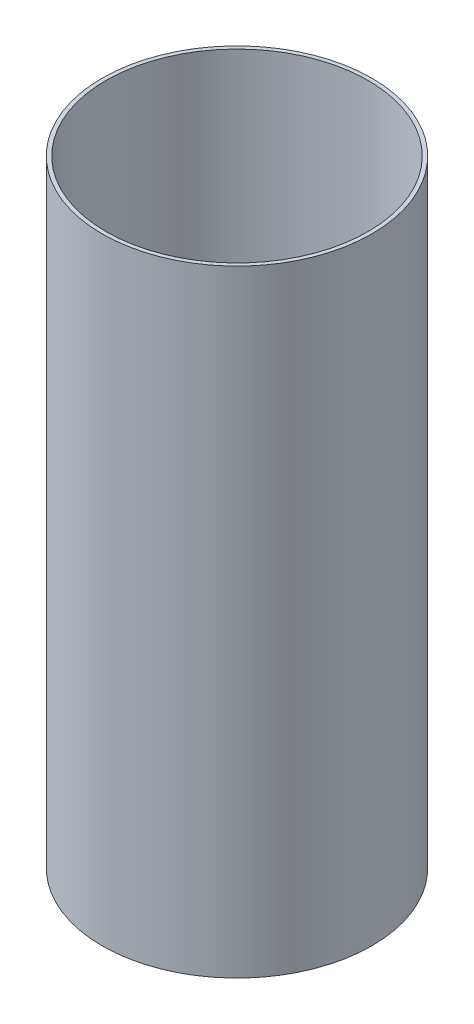
ISO-10303-21;
HEADER;
FILE_DESCRIPTION(('STEP AP214'),'2;1');
FILE_NAME('part.step','',(''),(''),'','','');
FILE_SCHEMA(('AUTOMOTIVE_DESIGN { 1 0 10303 214 1 1 1 1 }'));
ENDSEC;
DATA;
#1=APPLICATION_CONTEXT('core data for automotive mechanical design processes');
#2=APPLICATION_PROTOCOL_DEFINITION('international standard','automotive_design',2000,#1);
#3=PRODUCT_CONTEXT('',#1,'mechanical');
#4=PRODUCT('Part','Part','',(#3));
#5=PRODUCT_RELATED_PRODUCT_CATEGORY('part','',(#4));
#6=PRODUCT_DEFINITION_FORMATION('','',#4);
#7=PRODUCT_DEFINITION_CONTEXT('part definition',#1,'design');
#8=PRODUCT_DEFINITION('design','',#6,#7);
#9=PRODUCT_DEFINITION_SHAPE('','',#8);
#10=(LENGTH_UNIT() NAMED_UNIT(*) SI_UNIT(.MILLI.,.METRE.));
#11=(NAMED_UNIT(*) PLANE_ANGLE_UNIT() SI_UNIT($,.RADIAN.));
#12=(NAMED_UNIT(*) SI_UNIT($,.STERADIAN.) SOLID_ANGLE_UNIT());
#13=UNCERTAINTY_MEASURE_WITH_UNIT(LENGTH_MEASURE(1.E-05),#10,'distance_accuracy_value','');
#14=(GEOMETRIC_REPRESENTATION_CONTEXT(3) GLOBAL_UNCERTAINTY_ASSIGNED_CONTEXT((#13)) GLOBAL_UNIT_ASSIGNED_CONTEXT((#10,
#11,#12)) REPRESENTATION_CONTEXT('',''));
#15=CARTESIAN_POINT('',(0.,0.,0.));
#16=DIRECTION('',(0.,0.,1.));
#17=DIRECTION('',(1.,0.,0.));
#18=AXIS2_PLACEMENT_3D('',#15,#16,#17);
#19=CARTESIAN_POINT('',(0.,160.,0.));
#20=DIRECTION('',(0.,1.,0.));
#21=DIRECTION('',(0.,0.,1.));
#22=AXIS2_PLACEMENT_3D('',#19,#20,#21);
#23=PLANE('',#22);
#24=CARTESIAN_POINT('',(0.,160.,0.));
#25=DIRECTION('',(0.,1.,0.));
#26=DIRECTION('',(0.,0.,1.));
#27=AXIS2_PLACEMENT_3D('',#24,#25,#26);
#28=CIRCLE('',#27,35.);
#29=CARTESIAN_POINT('',(0.,160.,35.));
#30=VERTEX_POINT('',#29);
#31=EDGE_CURVE('E10',#30,#30,#28,.T.);
#32=ORIENTED_EDGE('',*,*,#31,.T.);
#33=EDGE_LOOP('',(#32));
#34=FACE_BOUND('',#33,.T.);
#35=CARTESIAN_POINT('',(0.,160.,0.));
#36=DIRECTION('',(0.,1.,0.));
#37=DIRECTION('',(0.,0.,1.));
#38=AXIS2_PLACEMENT_3D('',#35,#36,#37);
#39=CIRCLE('',#38,34.);
#40=CARTESIAN_POINT('',(0.,160.,34.));
#41=VERTEX_POINT('',#40);
#42=EDGE_CURVE('E42',#41,#41,#39,.T.);
#43=ORIENTED_EDGE('',*,*,#42,.F.);
#44=EDGE_LOOP('',(#43));
#45=FACE_BOUND('',#44,.T.);
#46=ADVANCED_FACE('F31',(#34,#45),#23,.T.);
#47=CARTESIAN_POINT('',(0.,0.,0.));
#48=DIRECTION('',(0.,1.,0.));
#49=DIRECTION('',(0.,0.,1.));
#50=AXIS2_PLACEMENT_3D('',#47,#48,#49);
#51=PLANE('',#50);
#52=CARTESIAN_POINT('',(0.,0.,0.));
#53=DIRECTION('',(0.,1.,0.));
#54=DIRECTION('',(0.,0.,1.));
#55=AXIS2_PLACEMENT_3D('',#52,#53,#54);
#56=CIRCLE('',#55,35.);
#57=CARTESIAN_POINT('',(0.,0.,35.));
#58=VERTEX_POINT('',#57);
#59=EDGE_CURVE('E35',#58,#58,#56,.T.);
#60=ORIENTED_EDGE('',*,*,#59,.F.);
#61=EDGE_LOOP('',(#60));
#62=FACE_BOUND('',#61,.T.);
#63=CARTESIAN_POINT('',(0.,0.,0.));
#64=DIRECTION('',(0.,1.,0.));
#65=DIRECTION('',(0.,0.,1.));
#66=AXIS2_PLACEMENT_3D('',#63,#64,#65);
#67=CIRCLE('',#66,34.);
#68=CARTESIAN_POINT('',(0.,0.,34.));
#69=VERTEX_POINT('',#68);
#70=EDGE_CURVE('E44',#69,#69,#67,.T.);
#71=ORIENTED_EDGE('',*,*,#70,.T.);
#72=EDGE_LOOP('',(#71));
#73=FACE_BOUND('',#72,.T.);
#74=ADVANCED_FACE('F54',(#62,#73),#51,.F.);
#75=CARTESIAN_POINT('',(0.,160.,0.));
#76=DIRECTION('',(0.,-1.,0.));
#77=DIRECTION('',(0.,0.,-1.));
#78=AXIS2_PLACEMENT_3D('',#75,#76,#77);
#79=CYLINDRICAL_SURFACE('',#78,35.);
#80=ORIENTED_EDGE('',*,*,#31,.F.);
#81=EDGE_LOOP('',(#80));
#82=FACE_BOUND('',#81,.T.);
#83=ORIENTED_EDGE('',*,*,#59,.T.);
#84=EDGE_LOOP('',(#83));
#85=FACE_BOUND('',#84,.T.);
#86=ADVANCED_FACE('F33',(#82,#85),#79,.T.);
#87=CARTESIAN_POINT('',(0.,160.,0.));
#88=DIRECTION('',(0.,-1.,0.));
#89=DIRECTION('',(0.,0.,-1.));
#90=AXIS2_PLACEMENT_3D('',#87,#88,#89);
#91=CYLINDRICAL_SURFACE('',#90,34.);
#92=ORIENTED_EDGE('',*,*,#42,.T.);
#93=EDGE_LOOP('',(#92));
#94=FACE_BOUND('',#93,.T.);
#95=ORIENTED_EDGE('',*,*,#70,.F.);
#96=EDGE_LOOP('',(#95));
#97=FACE_BOUND('',#96,.T.);
#98=ADVANCED_FACE('F50',(#94,#97),#91,.F.);
#99=CLOSED_SHELL('',(#46,#74,#86,#98));
#100=MANIFOLD_SOLID_BREP('B2',#99);
#101=ADVANCED_BREP_SHAPE_REPRESENTATION('',(#18,#100),#14);
#102=SHAPE_DEFINITION_REPRESENTATION(#9,#101);
ENDSEC;
END-ISO-10303-21;
